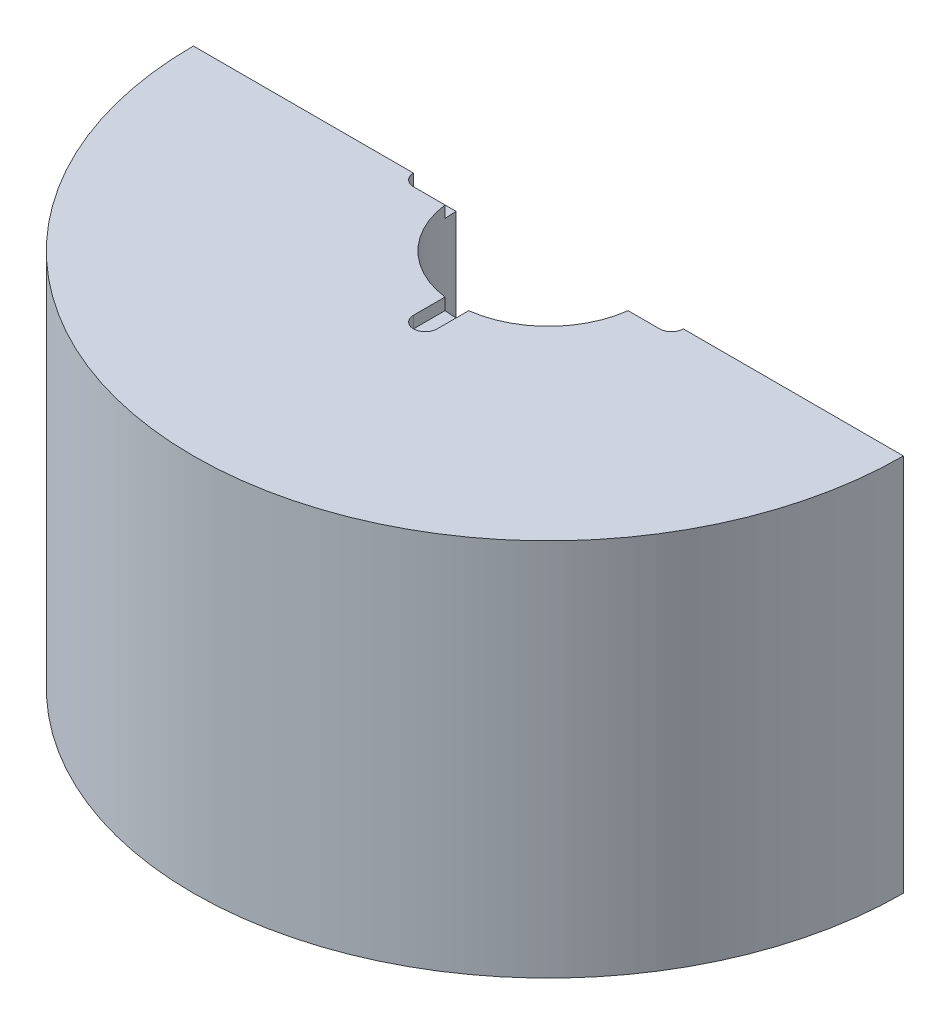
ISO-10303-21;
HEADER;
FILE_DESCRIPTION(('STEP AP214'),'2;1');
FILE_NAME('part.step','',(''),(''),'','','');
FILE_SCHEMA(('AUTOMOTIVE_DESIGN { 1 0 10303 214 1 1 1 1 }'));
ENDSEC;
DATA;
#1=APPLICATION_CONTEXT('core data for automotive mechanical design processes');
#2=APPLICATION_PROTOCOL_DEFINITION('international standard','automotive_design',2000,#1);
#3=PRODUCT_CONTEXT('',#1,'mechanical');
#4=PRODUCT('Part','Part','',(#3));
#5=PRODUCT_RELATED_PRODUCT_CATEGORY('part','',(#4));
#6=PRODUCT_DEFINITION_FORMATION('','',#4);
#7=PRODUCT_DEFINITION_CONTEXT('part definition',#1,'design');
#8=PRODUCT_DEFINITION('design','',#6,#7);
#9=PRODUCT_DEFINITION_SHAPE('','',#8);
#10=(LENGTH_UNIT() NAMED_UNIT(*) SI_UNIT(.MILLI.,.METRE.));
#11=(NAMED_UNIT(*) PLANE_ANGLE_UNIT() SI_UNIT($,.RADIAN.));
#12=(NAMED_UNIT(*) SI_UNIT($,.STERADIAN.) SOLID_ANGLE_UNIT());
#13=UNCERTAINTY_MEASURE_WITH_UNIT(LENGTH_MEASURE(1.E-05),#10,'distance_accuracy_value','');
#14=(GEOMETRIC_REPRESENTATION_CONTEXT(3) GLOBAL_UNCERTAINTY_ASSIGNED_CONTEXT((#13)) GLOBAL_UNIT_ASSIGNED_CONTEXT((#10,
#11,#12)) REPRESENTATION_CONTEXT('',''));
#15=CARTESIAN_POINT('',(0.,0.,0.));
#16=DIRECTION('',(0.,0.,1.));
#17=DIRECTION('',(1.,0.,0.));
#18=AXIS2_PLACEMENT_3D('',#15,#16,#17);
#19=CARTESIAN_POINT('',(0.,0.,0.));
#20=DIRECTION('',(0.,1.,0.));
#21=DIRECTION('',(0.,0.,1.));
#22=AXIS2_PLACEMENT_3D('',#19,#20,#21);
#23=PLANE('',#22);
#24=CARTESIAN_POINT('',(0.,0.,0.));
#25=DIRECTION('',(0.,1.,0.));
#26=DIRECTION('',(0.,0.,1.));
#27=AXIS2_PLACEMENT_3D('',#24,#25,#26);
#28=CIRCLE('',#27,39.);
#29=CARTESIAN_POINT('',(-38.6781592116275,0.,4.99999999999987));
#30=VERTEX_POINT('',#29);
#31=CARTESIAN_POINT('',(-4.99999999999999,0.,38.6781592116274));
#32=VERTEX_POINT('',#31);
#33=EDGE_CURVE('E469',#30,#32,#28,.T.);
#34=ORIENTED_EDGE('',*,*,#33,.T.);
#35=DIRECTION('',(0.,0.,-1.));
#36=VECTOR('',#35,1.);
#37=CARTESIAN_POINT('',(-4.99999999999999,0.,52.));
#38=LINE('',#37,#36);
#39=CARTESIAN_POINT('',(-4.99999999999999,0.,52.));
#40=VERTEX_POINT('',#39);
#41=EDGE_CURVE('E294',#40,#32,#38,.T.);
#42=ORIENTED_EDGE('',*,*,#41,.F.);
#43=CARTESIAN_POINT('',(0.,0.,52.));
#44=DIRECTION('',(0.,1.,0.));
#45=DIRECTION('',(0.,0.,1.));
#46=AXIS2_PLACEMENT_3D('',#43,#44,#45);
#47=CIRCLE('',#46,5.);
#48=CARTESIAN_POINT('',(5.00000000000001,0.,52.));
#49=VERTEX_POINT('',#48);
#50=EDGE_CURVE('E288',#40,#49,#47,.T.);
#51=ORIENTED_EDGE('',*,*,#50,.T.);
#52=DIRECTION('',(0.,0.,-1.));
#53=VECTOR('',#52,1.);
#54=CARTESIAN_POINT('',(5.00000000000001,0.,52.));
#55=LINE('',#54,#53);
#56=CARTESIAN_POINT('',(5.00000000000001,0.,38.6781592116274));
#57=VERTEX_POINT('',#56);
#58=EDGE_CURVE('E123',#49,#57,#55,.T.);
#59=ORIENTED_EDGE('',*,*,#58,.T.);
#60=CARTESIAN_POINT('',(38.6781592116274,0.,5.00000000000041));
#61=VERTEX_POINT('',#60);
#62=EDGE_CURVE('E450',#57,#61,#28,.T.);
#63=ORIENTED_EDGE('',*,*,#62,.T.);
#64=DIRECTION('',(-1.,0.,0.));
#65=VECTOR('',#64,1.);
#66=CARTESIAN_POINT('',(51.9999999999999,0.,5.00000000000055));
#67=LINE('',#66,#65);
#68=CARTESIAN_POINT('',(51.9999999999999,0.,5.00000000000055));
#69=VERTEX_POINT('',#68);
#70=EDGE_CURVE('E313',#69,#61,#67,.T.);
#71=ORIENTED_EDGE('',*,*,#70,.F.);
#72=CARTESIAN_POINT('',(52.,0.,5.4524181940787E-13));
#73=DIRECTION('',(0.,1.,0.));
#74=DIRECTION('',(0.,0.,1.));
#75=AXIS2_PLACEMENT_3D('',#72,#73,#74);
#76=CIRCLE('',#75,5.);
#77=CARTESIAN_POINT('',(57.,0.,0.));
#78=VERTEX_POINT('',#77);
#79=EDGE_CURVE('E307',#69,#78,#76,.T.);
#80=ORIENTED_EDGE('',*,*,#79,.T.);
#81=DIRECTION('',(1.,0.,0.));
#82=VECTOR('',#81,1.);
#83=CARTESIAN_POINT('',(0.,0.,0.));
#84=LINE('',#83,#82);
#85=CARTESIAN_POINT('',(150.,0.,0.));
#86=VERTEX_POINT('',#85);
#87=EDGE_CURVE('E456',#78,#86,#84,.T.);
#88=ORIENTED_EDGE('',*,*,#87,.T.);
#89=CARTESIAN_POINT('',(0.,0.,0.));
#90=DIRECTION('',(0.,1.,0.));
#91=DIRECTION('',(0.,0.,1.));
#92=AXIS2_PLACEMENT_3D('',#89,#90,#91);
#93=CIRCLE('',#92,150.);
#94=CARTESIAN_POINT('',(-150.,0.,0.));
#95=VERTEX_POINT('',#94);
#96=EDGE_CURVE('E474',#95,#86,#93,.T.);
#97=ORIENTED_EDGE('',*,*,#96,.F.);
#98=CARTESIAN_POINT('',(-57.,0.,0.));
#99=VERTEX_POINT('',#98);
#100=EDGE_CURVE('E470',#95,#99,#84,.T.);
#101=ORIENTED_EDGE('',*,*,#100,.T.);
#102=CARTESIAN_POINT('',(-52.,0.,-1.7865831321623E-13));
#103=DIRECTION('',(0.,1.,0.));
#104=DIRECTION('',(0.,0.,1.));
#105=AXIS2_PLACEMENT_3D('',#102,#103,#104);
#106=CIRCLE('',#105,5.);
#107=CARTESIAN_POINT('',(-52.,0.,4.99999999999982));
#108=VERTEX_POINT('',#107);
#109=EDGE_CURVE('E508',#108,#99,#106,.F.);
#110=ORIENTED_EDGE('',*,*,#109,.F.);
#111=DIRECTION('',(1.,0.,0.));
#112=VECTOR('',#111,1.);
#113=CARTESIAN_POINT('',(-52.,0.,4.99999999999982));
#114=LINE('',#113,#112);
#115=EDGE_CURVE('E318',#108,#30,#114,.T.);
#116=ORIENTED_EDGE('',*,*,#115,.T.);
#117=EDGE_LOOP('',(#34,#42,#51,#59,#63,#71,#80,#88,#97,#101,#110,#116));
#118=FACE_BOUND('',#117,.T.);
#119=ADVANCED_FACE('F107',(#118),#23,.F.);
#120=CARTESIAN_POINT('',(0.,160.,0.));
#121=DIRECTION('',(0.,-1.,0.));
#122=DIRECTION('',(0.,0.,-1.));
#123=AXIS2_PLACEMENT_3D('',#120,#121,#122);
#124=CYLINDRICAL_SURFACE('',#123,39.);
#125=DIRECTION('',(0.,-1.,0.));
#126=VECTOR('',#125,1.);
#127=CARTESIAN_POINT('',(-4.99999999999999,160.,38.6781592116274));
#128=LINE('',#127,#126);
#129=CARTESIAN_POINT('',(-4.99999999999999,5.,38.6781592116274));
#130=VERTEX_POINT('',#129);
#131=EDGE_CURVE('E352',#32,#130,#128,.F.);
#132=ORIENTED_EDGE('',*,*,#131,.F.);
#133=ORIENTED_EDGE('',*,*,#33,.F.);
#134=DIRECTION('',(0.,-1.,0.));
#135=VECTOR('',#134,1.);
#136=CARTESIAN_POINT('',(-38.6781592116275,160.,4.99999999999987));
#137=LINE('',#136,#135);
#138=CARTESIAN_POINT('',(-38.6781592116275,5.,4.99999999999987));
#139=VERTEX_POINT('',#138);
#140=EDGE_CURVE('E278',#30,#139,#137,.F.);
#141=ORIENTED_EDGE('',*,*,#140,.T.);
#142=CARTESIAN_POINT('',(0.,5.,0.));
#143=DIRECTION('',(0.,1.,0.));
#144=DIRECTION('',(0.,0.,1.));
#145=AXIS2_PLACEMENT_3D('',#142,#143,#144);
#146=CIRCLE('',#145,39.);
#147=CARTESIAN_POINT('',(-39.,5.,0.));
#148=VERTEX_POINT('',#147);
#149=EDGE_CURVE('E358',#148,#139,#146,.T.);
#150=ORIENTED_EDGE('',*,*,#149,.F.);
#151=DIRECTION('',(0.,-1.,0.));
#152=VECTOR('',#151,1.);
#153=CARTESIAN_POINT('',(-39.,160.,0.));
#154=LINE('',#153,#152);
#155=CARTESIAN_POINT('',(-39.,155.,0.));
#156=VERTEX_POINT('',#155);
#157=EDGE_CURVE('E489',#156,#148,#154,.T.);
#158=ORIENTED_EDGE('',*,*,#157,.F.);
#159=CARTESIAN_POINT('',(0.,155.,0.));
#160=DIRECTION('',(0.,1.,0.));
#161=DIRECTION('',(0.,0.,1.));
#162=AXIS2_PLACEMENT_3D('',#159,#160,#161);
#163=CIRCLE('',#162,39.);
#164=CARTESIAN_POINT('',(-38.6781592116275,155.,4.99999999999987));
#165=VERTEX_POINT('',#164);
#166=EDGE_CURVE('E370',#165,#156,#163,.F.);
#167=ORIENTED_EDGE('',*,*,#166,.F.);
#168=DIRECTION('',(0.,1.,0.));
#169=VECTOR('',#168,1.);
#170=CARTESIAN_POINT('',(-38.6781592116275,155.,4.99999999999987));
#171=LINE('',#170,#169);
#172=CARTESIAN_POINT('',(-38.6781592116275,160.,4.99999999999987));
#173=VERTEX_POINT('',#172);
#174=EDGE_CURVE('E377',#165,#173,#171,.T.);
#175=ORIENTED_EDGE('',*,*,#174,.T.);
#176=CARTESIAN_POINT('',(0.,160.,0.));
#177=DIRECTION('',(0.,1.,0.));
#178=DIRECTION('',(0.,0.,1.));
#179=AXIS2_PLACEMENT_3D('',#176,#177,#178);
#180=CIRCLE('',#179,39.);
#181=CARTESIAN_POINT('',(-4.99999999999999,160.,38.6781592116274));
#182=VERTEX_POINT('',#181);
#183=EDGE_CURVE('E455',#173,#182,#180,.T.);
#184=ORIENTED_EDGE('',*,*,#183,.T.);
#185=DIRECTION('',(0.,-1.,0.));
#186=VECTOR('',#185,1.);
#187=CARTESIAN_POINT('',(-4.99999999999999,160.,38.6781592116274));
#188=LINE('',#187,#186);
#189=CARTESIAN_POINT('',(-4.99999999999999,155.,38.6781592116274));
#190=VERTEX_POINT('',#189);
#191=EDGE_CURVE('E381',#182,#190,#188,.T.);
#192=ORIENTED_EDGE('',*,*,#191,.T.);
#193=CARTESIAN_POINT('',(0.,155.,0.));
#194=DIRECTION('',(0.,1.,0.));
#195=DIRECTION('',(0.,0.,1.));
#196=AXIS2_PLACEMENT_3D('',#193,#194,#195);
#197=CIRCLE('',#196,39.);
#198=CARTESIAN_POINT('',(5.00000000000001,155.,38.6781592116274));
#199=VERTEX_POINT('',#198);
#200=EDGE_CURVE('E504',#190,#199,#197,.T.);
#201=ORIENTED_EDGE('',*,*,#200,.T.);
#202=DIRECTION('',(0.,-1.,0.));
#203=VECTOR('',#202,1.);
#204=CARTESIAN_POINT('',(5.00000000000001,160.,38.6781592116274));
#205=LINE('',#204,#203);
#206=CARTESIAN_POINT('',(5.00000000000001,160.,38.6781592116274));
#207=VERTEX_POINT('',#206);
#208=EDGE_CURVE('E441',#207,#199,#205,.T.);
#209=ORIENTED_EDGE('',*,*,#208,.F.);
#210=CARTESIAN_POINT('',(38.6781592116274,160.,5.00000000000041));
#211=VERTEX_POINT('',#210);
#212=EDGE_CURVE('E451',#207,#211,#180,.T.);
#213=ORIENTED_EDGE('',*,*,#212,.T.);
#214=DIRECTION('',(0.,1.,0.));
#215=VECTOR('',#214,1.);
#216=CARTESIAN_POINT('',(38.6781592116274,155.,5.00000000000041));
#217=LINE('',#216,#215);
#218=CARTESIAN_POINT('',(38.6781592116274,155.,5.00000000000041));
#219=VERTEX_POINT('',#218);
#220=EDGE_CURVE('E390',#219,#211,#217,.T.);
#221=ORIENTED_EDGE('',*,*,#220,.F.);
#222=CARTESIAN_POINT('',(0.,155.,0.));
#223=DIRECTION('',(0.,1.,0.));
#224=DIRECTION('',(0.,0.,1.));
#225=AXIS2_PLACEMENT_3D('',#222,#223,#224);
#226=CIRCLE('',#225,39.);
#227=CARTESIAN_POINT('',(39.,155.,0.));
#228=VERTEX_POINT('',#227);
#229=EDGE_CURVE('E389',#219,#228,#226,.T.);
#230=ORIENTED_EDGE('',*,*,#229,.T.);
#231=DIRECTION('',(0.,-1.,0.));
#232=VECTOR('',#231,1.);
#233=CARTESIAN_POINT('',(39.,160.,0.));
#234=LINE('',#233,#232);
#235=CARTESIAN_POINT('',(39.,5.,0.));
#236=VERTEX_POINT('',#235);
#237=EDGE_CURVE('E478',#228,#236,#234,.T.);
#238=ORIENTED_EDGE('',*,*,#237,.T.);
#239=CARTESIAN_POINT('',(0.,5.,0.));
#240=DIRECTION('',(0.,1.,0.));
#241=DIRECTION('',(0.,0.,1.));
#242=AXIS2_PLACEMENT_3D('',#239,#240,#241);
#243=CIRCLE('',#242,39.);
#244=CARTESIAN_POINT('',(38.6781592116274,5.,5.00000000000041));
#245=VERTEX_POINT('',#244);
#246=EDGE_CURVE('E355',#245,#236,#243,.T.);
#247=ORIENTED_EDGE('',*,*,#246,.F.);
#248=DIRECTION('',(0.,-1.,0.));
#249=VECTOR('',#248,1.);
#250=CARTESIAN_POINT('',(38.6781592116274,160.,5.00000000000041));
#251=LINE('',#250,#249);
#252=EDGE_CURVE('E346',#61,#245,#251,.F.);
#253=ORIENTED_EDGE('',*,*,#252,.F.);
#254=ORIENTED_EDGE('',*,*,#62,.F.);
#255=DIRECTION('',(0.,-1.,0.));
#256=VECTOR('',#255,1.);
#257=CARTESIAN_POINT('',(5.00000000000001,160.,38.6781592116274));
#258=LINE('',#257,#256);
#259=CARTESIAN_POINT('',(5.00000000000001,5.,38.6781592116274));
#260=VERTEX_POINT('',#259);
#261=EDGE_CURVE('E349',#57,#260,#258,.F.);
#262=ORIENTED_EDGE('',*,*,#261,.T.);
#263=CARTESIAN_POINT('',(0.,5.,0.));
#264=DIRECTION('',(0.,1.,0.));
#265=DIRECTION('',(0.,0.,1.));
#266=AXIS2_PLACEMENT_3D('',#263,#264,#265);
#267=CIRCLE('',#266,39.);
#268=EDGE_CURVE('E12',#130,#260,#267,.T.);
#269=ORIENTED_EDGE('',*,*,#268,.F.);
#270=EDGE_LOOP('',(#132,#133,#141,#150,#158,#167,#175,#184,#192,#201,#209,#213,#221,#230,#238,
#247,#253,#254,#262,#269));
#271=FACE_BOUND('',#270,.T.);
#272=ADVANCED_FACE('F109',(#271),#124,.F.);
#273=CARTESIAN_POINT('',(0.,160.,0.));
#274=DIRECTION('',(0.,1.,0.));
#275=DIRECTION('',(0.,0.,1.));
#276=AXIS2_PLACEMENT_3D('',#273,#274,#275);
#277=PLANE('',#276);
#278=DIRECTION('',(1.,0.,0.));
#279=VECTOR('',#278,1.);
#280=CARTESIAN_POINT('',(0.,160.,5.));
#281=LINE('',#280,#279);
#282=CARTESIAN_POINT('',(-52.,160.,4.99999999999982));
#283=VERTEX_POINT('',#282);
#284=EDGE_CURVE('E366',#283,#173,#281,.T.);
#285=ORIENTED_EDGE('',*,*,#284,.F.);
#286=CARTESIAN_POINT('',(-52.,160.,-1.7865831321623E-13));
#287=DIRECTION('',(0.,1.,0.));
#288=DIRECTION('',(0.,0.,1.));
#289=AXIS2_PLACEMENT_3D('',#286,#287,#288);
#290=CIRCLE('',#289,5.);
#291=CARTESIAN_POINT('',(-57.,160.,0.));
#292=VERTEX_POINT('',#291);
#293=EDGE_CURVE('E493',#292,#283,#290,.T.);
#294=ORIENTED_EDGE('',*,*,#293,.F.);
#295=DIRECTION('',(1.,0.,0.));
#296=VECTOR('',#295,1.);
#297=CARTESIAN_POINT('',(0.,160.,0.));
#298=LINE('',#297,#296);
#299=CARTESIAN_POINT('',(-150.,160.,0.));
#300=VERTEX_POINT('',#299);
#301=EDGE_CURVE('E457',#300,#292,#298,.T.);
#302=ORIENTED_EDGE('',*,*,#301,.F.);
#303=CARTESIAN_POINT('',(0.,160.,0.));
#304=DIRECTION('',(0.,1.,0.));
#305=DIRECTION('',(0.,0.,1.));
#306=AXIS2_PLACEMENT_3D('',#303,#304,#305);
#307=CIRCLE('',#306,150.);
#308=CARTESIAN_POINT('',(150.,160.,0.));
#309=VERTEX_POINT('',#308);
#310=EDGE_CURVE('E461',#300,#309,#307,.T.);
#311=ORIENTED_EDGE('',*,*,#310,.T.);
#312=CARTESIAN_POINT('',(57.,160.,0.));
#313=VERTEX_POINT('',#312);
#314=EDGE_CURVE('E462',#313,#309,#298,.T.);
#315=ORIENTED_EDGE('',*,*,#314,.F.);
#316=CARTESIAN_POINT('',(52.,160.,5.4524181940787E-13));
#317=DIRECTION('',(0.,1.,0.));
#318=DIRECTION('',(0.,0.,1.));
#319=AXIS2_PLACEMENT_3D('',#316,#317,#318);
#320=CIRCLE('',#319,5.);
#321=CARTESIAN_POINT('',(52.,160.,5.00000000000055));
#322=VERTEX_POINT('',#321);
#323=EDGE_CURVE('E394',#322,#313,#320,.T.);
#324=ORIENTED_EDGE('',*,*,#323,.F.);
#325=DIRECTION('',(-1.,0.,0.));
#326=VECTOR('',#325,1.);
#327=CARTESIAN_POINT('',(0.,160.,5.));
#328=LINE('',#327,#326);
#329=EDGE_CURVE('E376',#322,#211,#328,.T.);
#330=ORIENTED_EDGE('',*,*,#329,.T.);
#331=ORIENTED_EDGE('',*,*,#212,.F.);
#332=DIRECTION('',(0.,0.,-1.));
#333=VECTOR('',#332,1.);
#334=CARTESIAN_POINT('',(5.00000000000001,160.,52.));
#335=LINE('',#334,#333);
#336=CARTESIAN_POINT('',(5.00000000000001,160.,52.));
#337=VERTEX_POINT('',#336);
#338=EDGE_CURVE('E393',#337,#207,#335,.T.);
#339=ORIENTED_EDGE('',*,*,#338,.F.);
#340=CARTESIAN_POINT('',(0.,160.,52.));
#341=DIRECTION('',(0.,1.,0.));
#342=DIRECTION('',(0.,0.,1.));
#343=AXIS2_PLACEMENT_3D('',#340,#341,#342);
#344=CIRCLE('',#343,5.);
#345=CARTESIAN_POINT('',(-4.99999999999999,160.,52.));
#346=VERTEX_POINT('',#345);
#347=EDGE_CURVE('E422',#346,#337,#344,.T.);
#348=ORIENTED_EDGE('',*,*,#347,.F.);
#349=DIRECTION('',(0.,0.,-1.));
#350=VECTOR('',#349,1.);
#351=CARTESIAN_POINT('',(-4.99999999999999,160.,52.));
#352=LINE('',#351,#350);
#353=EDGE_CURVE('E411',#346,#182,#352,.T.);
#354=ORIENTED_EDGE('',*,*,#353,.T.);
#355=ORIENTED_EDGE('',*,*,#183,.F.);
#356=EDGE_LOOP('',(#285,#294,#302,#311,#315,#324,#330,#331,#339,#348,#354,#355));
#357=FACE_BOUND('',#356,.T.);
#358=ADVANCED_FACE('F542',(#357),#277,.T.);
#359=CARTESIAN_POINT('',(0.,160.,0.));
#360=DIRECTION('',(0.,0.,-1.));
#361=DIRECTION('',(-1.,0.,0.));
#362=AXIS2_PLACEMENT_3D('',#359,#360,#361);
#363=PLANE('',#362);
#364=DIRECTION('',(1.,0.,0.));
#365=VECTOR('',#364,1.);
#366=CARTESIAN_POINT('',(0.,5.,0.));
#367=LINE('',#366,#365);
#368=CARTESIAN_POINT('',(-57.,5.,0.));
#369=VERTEX_POINT('',#368);
#370=EDGE_CURVE('E116',#369,#148,#367,.T.);
#371=ORIENTED_EDGE('',*,*,#370,.F.);
#372=DIRECTION('',(0.,-1.,0.));
#373=VECTOR('',#372,1.);
#374=CARTESIAN_POINT('',(-57.,5.,0.));
#375=LINE('',#374,#373);
#376=EDGE_CURVE('E340',#369,#99,#375,.T.);
#377=ORIENTED_EDGE('',*,*,#376,.T.);
#378=ORIENTED_EDGE('',*,*,#100,.F.);
#379=DIRECTION('',(0.,-1.,0.));
#380=VECTOR('',#379,1.);
#381=CARTESIAN_POINT('',(-150.,160.,0.));
#382=LINE('',#381,#380);
#383=EDGE_CURVE('E486',#300,#95,#382,.T.);
#384=ORIENTED_EDGE('',*,*,#383,.F.);
#385=ORIENTED_EDGE('',*,*,#301,.T.);
#386=DIRECTION('',(0.,1.,0.));
#387=VECTOR('',#386,1.);
#388=CARTESIAN_POINT('',(-57.,155.,0.));
#389=LINE('',#388,#387);
#390=CARTESIAN_POINT('',(-57.,155.,0.));
#391=VERTEX_POINT('',#390);
#392=EDGE_CURVE('E447',#391,#292,#389,.T.);
#393=ORIENTED_EDGE('',*,*,#392,.F.);
#394=DIRECTION('',(1.,0.,0.));
#395=VECTOR('',#394,1.);
#396=CARTESIAN_POINT('',(0.,155.,0.));
#397=LINE('',#396,#395);
#398=EDGE_CURVE('E500',#391,#156,#397,.T.);
#399=ORIENTED_EDGE('',*,*,#398,.T.);
#400=ORIENTED_EDGE('',*,*,#157,.T.);
#401=EDGE_LOOP('',(#371,#377,#378,#384,#385,#393,#399,#400));
#402=FACE_BOUND('',#401,.T.);
#403=ADVANCED_FACE('F526',(#402),#363,.T.);
#404=CARTESIAN_POINT('',(0.,160.,0.));
#405=DIRECTION('',(0.,-1.,0.));
#406=DIRECTION('',(0.,0.,-1.));
#407=AXIS2_PLACEMENT_3D('',#404,#405,#406);
#408=CYLINDRICAL_SURFACE('',#407,150.);
#409=ORIENTED_EDGE('',*,*,#96,.T.);
#410=DIRECTION('',(0.,-1.,0.));
#411=VECTOR('',#410,1.);
#412=CARTESIAN_POINT('',(150.,160.,0.));
#413=LINE('',#412,#411);
#414=EDGE_CURVE('E482',#309,#86,#413,.T.);
#415=ORIENTED_EDGE('',*,*,#414,.F.);
#416=ORIENTED_EDGE('',*,*,#310,.F.);
#417=ORIENTED_EDGE('',*,*,#383,.T.);
#418=EDGE_LOOP('',(#409,#415,#416,#417));
#419=FACE_BOUND('',#418,.T.);
#420=ADVANCED_FACE('F602',(#419),#408,.T.);
#421=DIRECTION('',(1.,0.,0.));
#422=VECTOR('',#421,1.);
#423=CARTESIAN_POINT('',(0.,5.,0.));
#424=LINE('',#423,#422);
#425=CARTESIAN_POINT('',(57.,5.,0.));
#426=VERTEX_POINT('',#425);
#427=EDGE_CURVE('E511',#236,#426,#424,.T.);
#428=ORIENTED_EDGE('',*,*,#427,.F.);
#429=ORIENTED_EDGE('',*,*,#237,.F.);
#430=DIRECTION('',(1.,0.,0.));
#431=VECTOR('',#430,1.);
#432=CARTESIAN_POINT('',(0.,155.,0.));
#433=LINE('',#432,#431);
#434=CARTESIAN_POINT('',(57.,155.,0.));
#435=VERTEX_POINT('',#434);
#436=EDGE_CURVE('E496',#228,#435,#433,.T.);
#437=ORIENTED_EDGE('',*,*,#436,.T.);
#438=DIRECTION('',(0.,1.,0.));
#439=VECTOR('',#438,1.);
#440=CARTESIAN_POINT('',(57.,155.,0.));
#441=LINE('',#440,#439);
#442=EDGE_CURVE('E444',#313,#435,#441,.F.);
#443=ORIENTED_EDGE('',*,*,#442,.F.);
#444=ORIENTED_EDGE('',*,*,#314,.T.);
#445=ORIENTED_EDGE('',*,*,#414,.T.);
#446=ORIENTED_EDGE('',*,*,#87,.F.);
#447=DIRECTION('',(0.,-1.,0.));
#448=VECTOR('',#447,1.);
#449=CARTESIAN_POINT('',(57.,5.,0.));
#450=LINE('',#449,#448);
#451=EDGE_CURVE('E131',#78,#426,#450,.F.);
#452=ORIENTED_EDGE('',*,*,#451,.T.);
#453=EDGE_LOOP('',(#428,#429,#437,#443,#444,#445,#446,#452));
#454=FACE_BOUND('',#453,.T.);
#455=ADVANCED_FACE('F569',(#454),#363,.T.);
#456=CARTESIAN_POINT('',(0.,155.,52.));
#457=DIRECTION('',(0.,1.,0.));
#458=DIRECTION('',(0.,0.,1.));
#459=AXIS2_PLACEMENT_3D('',#456,#457,#458);
#460=PLANE('',#459);
#461=DIRECTION('',(0.,0.,-1.));
#462=VECTOR('',#461,1.);
#463=CARTESIAN_POINT('',(-4.99999999999999,155.,52.));
#464=LINE('',#463,#462);
#465=CARTESIAN_POINT('',(-4.99999999999999,155.,52.));
#466=VERTEX_POINT('',#465);
#467=EDGE_CURVE('E418',#466,#190,#464,.T.);
#468=ORIENTED_EDGE('',*,*,#467,.F.);
#469=CARTESIAN_POINT('',(0.,155.,52.));
#470=DIRECTION('',(0.,1.,0.));
#471=DIRECTION('',(0.,0.,1.));
#472=AXIS2_PLACEMENT_3D('',#469,#470,#471);
#473=CIRCLE('',#472,5.);
#474=CARTESIAN_POINT('',(5.00000000000001,155.,52.));
#475=VERTEX_POINT('',#474);
#476=EDGE_CURVE('E431',#466,#475,#473,.T.);
#477=ORIENTED_EDGE('',*,*,#476,.T.);
#478=DIRECTION('',(0.,0.,-1.));
#479=VECTOR('',#478,1.);
#480=CARTESIAN_POINT('',(5.00000000000001,155.,52.));
#481=LINE('',#480,#479);
#482=EDGE_CURVE('E415',#475,#199,#481,.T.);
#483=ORIENTED_EDGE('',*,*,#482,.T.);
#484=ORIENTED_EDGE('',*,*,#200,.F.);
#485=EDGE_LOOP('',(#468,#477,#483,#484));
#486=FACE_BOUND('',#485,.T.);
#487=ADVANCED_FACE('F601',(#486),#460,.T.);
#488=CARTESIAN_POINT('',(0.,155.,52.));
#489=DIRECTION('',(0.,1.,0.));
#490=DIRECTION('',(0.,0.,1.));
#491=AXIS2_PLACEMENT_3D('',#488,#489,#490);
#492=CYLINDRICAL_SURFACE('',#491,5.);
#493=ORIENTED_EDGE('',*,*,#347,.T.);
#494=DIRECTION('',(0.,1.,0.));
#495=VECTOR('',#494,1.);
#496=CARTESIAN_POINT('',(5.00000000000001,155.,52.));
#497=LINE('',#496,#495);
#498=EDGE_CURVE('E428',#337,#475,#497,.F.);
#499=ORIENTED_EDGE('',*,*,#498,.T.);
#500=ORIENTED_EDGE('',*,*,#476,.F.);
#501=DIRECTION('',(0.,1.,0.));
#502=VECTOR('',#501,1.);
#503=CARTESIAN_POINT('',(-4.99999999999999,155.,52.));
#504=LINE('',#503,#502);
#505=EDGE_CURVE('E361',#346,#466,#504,.F.);
#506=ORIENTED_EDGE('',*,*,#505,.F.);
#507=EDGE_LOOP('',(#493,#499,#500,#506));
#508=FACE_BOUND('',#507,.T.);
#509=ADVANCED_FACE('F603',(#508),#492,.F.);
#510=CARTESIAN_POINT('',(5.00000000000001,155.,52.));
#511=DIRECTION('',(1.,0.,0.));
#512=DIRECTION('',(0.,0.,-1.));
#513=AXIS2_PLACEMENT_3D('',#510,#511,#512);
#514=PLANE('',#513);
#515=ORIENTED_EDGE('',*,*,#208,.T.);
#516=ORIENTED_EDGE('',*,*,#482,.F.);
#517=ORIENTED_EDGE('',*,*,#498,.F.);
#518=ORIENTED_EDGE('',*,*,#338,.T.);
#519=EDGE_LOOP('',(#515,#516,#517,#518));
#520=FACE_BOUND('',#519,.T.);
#521=ADVANCED_FACE('F630',(#520),#514,.F.);
#522=CARTESIAN_POINT('',(-4.99999999999999,155.,52.));
#523=DIRECTION('',(1.,0.,0.));
#524=DIRECTION('',(0.,0.,-1.));
#525=AXIS2_PLACEMENT_3D('',#522,#523,#524);
#526=PLANE('',#525);
#527=ORIENTED_EDGE('',*,*,#353,.F.);
#528=ORIENTED_EDGE('',*,*,#505,.T.);
#529=ORIENTED_EDGE('',*,*,#467,.T.);
#530=ORIENTED_EDGE('',*,*,#191,.F.);
#531=EDGE_LOOP('',(#527,#528,#529,#530));
#532=FACE_BOUND('',#531,.T.);
#533=ADVANCED_FACE('F622',(#532),#526,.T.);
#534=CARTESIAN_POINT('',(0.,155.,5.));
#535=DIRECTION('',(0.,0.,-1.));
#536=DIRECTION('',(-1.,0.,0.));
#537=AXIS2_PLACEMENT_3D('',#534,#535,#536);
#538=PLANE('',#537);
#539=ORIENTED_EDGE('',*,*,#329,.F.);
#540=DIRECTION('',(0.,1.,0.));
#541=VECTOR('',#540,1.);
#542=CARTESIAN_POINT('',(51.9999999999999,155.,5.00000000000055));
#543=LINE('',#542,#541);
#544=CARTESIAN_POINT('',(51.9999999999999,155.,5.00000000000055));
#545=VERTEX_POINT('',#544);
#546=EDGE_CURVE('E385',#545,#322,#543,.T.);
#547=ORIENTED_EDGE('',*,*,#546,.F.);
#548=DIRECTION('',(-1.,0.,0.));
#549=VECTOR('',#548,1.);
#550=CARTESIAN_POINT('',(0.,155.,5.));
#551=LINE('',#550,#549);
#552=EDGE_CURVE('E397',#545,#219,#551,.T.);
#553=ORIENTED_EDGE('',*,*,#552,.T.);
#554=ORIENTED_EDGE('',*,*,#220,.T.);
#555=EDGE_LOOP('',(#539,#547,#553,#554));
#556=FACE_BOUND('',#555,.T.);
#557=ADVANCED_FACE('F641',(#556),#538,.T.);
#558=CARTESIAN_POINT('',(52.,155.,5.4524181940787E-13));
#559=DIRECTION('',(0.,1.,0.));
#560=DIRECTION('',(0.,0.,1.));
#561=AXIS2_PLACEMENT_3D('',#558,#559,#560);
#562=CYLINDRICAL_SURFACE('',#561,5.);
#563=ORIENTED_EDGE('',*,*,#442,.T.);
#564=CARTESIAN_POINT('',(52.,155.,5.4524181940787E-13));
#565=DIRECTION('',(0.,1.,0.));
#566=DIRECTION('',(0.,0.,1.));
#567=AXIS2_PLACEMENT_3D('',#564,#565,#566);
#568=CIRCLE('',#567,5.);
#569=EDGE_CURVE('E404',#545,#435,#568,.T.);
#570=ORIENTED_EDGE('',*,*,#569,.F.);
#571=ORIENTED_EDGE('',*,*,#546,.T.);
#572=ORIENTED_EDGE('',*,*,#323,.T.);
#573=EDGE_LOOP('',(#563,#570,#571,#572));
#574=FACE_BOUND('',#573,.T.);
#575=ADVANCED_FACE('F656',(#574),#562,.F.);
#576=CARTESIAN_POINT('',(0.,155.,0.));
#577=DIRECTION('',(0.,1.,0.));
#578=DIRECTION('',(0.,0.,1.));
#579=AXIS2_PLACEMENT_3D('',#576,#577,#578);
#580=PLANE('',#579);
#581=ORIENTED_EDGE('',*,*,#229,.F.);
#582=ORIENTED_EDGE('',*,*,#552,.F.);
#583=ORIENTED_EDGE('',*,*,#569,.T.);
#584=ORIENTED_EDGE('',*,*,#436,.F.);
#585=EDGE_LOOP('',(#581,#582,#583,#584));
#586=FACE_BOUND('',#585,.T.);
#587=ADVANCED_FACE('F665',(#586),#580,.T.);
#588=CARTESIAN_POINT('',(0.,155.,5.));
#589=DIRECTION('',(0.,0.,1.));
#590=DIRECTION('',(1.,0.,0.));
#591=AXIS2_PLACEMENT_3D('',#588,#589,#590);
#592=PLANE('',#591);
#593=ORIENTED_EDGE('',*,*,#284,.T.);
#594=ORIENTED_EDGE('',*,*,#174,.F.);
#595=DIRECTION('',(1.,0.,0.));
#596=VECTOR('',#595,1.);
#597=CARTESIAN_POINT('',(0.,155.,5.));
#598=LINE('',#597,#596);
#599=CARTESIAN_POINT('',(-52.,155.,4.99999999999982));
#600=VERTEX_POINT('',#599);
#601=EDGE_CURVE('E365',#600,#165,#598,.T.);
#602=ORIENTED_EDGE('',*,*,#601,.F.);
#603=DIRECTION('',(0.,1.,0.));
#604=VECTOR('',#603,1.);
#605=CARTESIAN_POINT('',(-52.,155.,4.99999999999982));
#606=LINE('',#605,#604);
#607=EDGE_CURVE('E373',#600,#283,#606,.T.);
#608=ORIENTED_EDGE('',*,*,#607,.T.);
#609=EDGE_LOOP('',(#593,#594,#602,#608));
#610=FACE_BOUND('',#609,.T.);
#611=ADVANCED_FACE('F538',(#610),#592,.F.);
#612=CARTESIAN_POINT('',(-52.,155.,-1.7865831321623E-13));
#613=DIRECTION('',(0.,1.,0.));
#614=DIRECTION('',(0.,0.,1.));
#615=AXIS2_PLACEMENT_3D('',#612,#613,#614);
#616=CYLINDRICAL_SURFACE('',#615,5.);
#617=ORIENTED_EDGE('',*,*,#392,.T.);
#618=ORIENTED_EDGE('',*,*,#293,.T.);
#619=ORIENTED_EDGE('',*,*,#607,.F.);
#620=CARTESIAN_POINT('',(-52.,155.,-1.7865831321623E-13));
#621=DIRECTION('',(0.,1.,0.));
#622=DIRECTION('',(0.,0.,1.));
#623=AXIS2_PLACEMENT_3D('',#620,#621,#622);
#624=CIRCLE('',#623,5.);
#625=EDGE_CURVE('E362',#391,#600,#624,.T.);
#626=ORIENTED_EDGE('',*,*,#625,.F.);
#627=EDGE_LOOP('',(#617,#618,#619,#626));
#628=FACE_BOUND('',#627,.T.);
#629=ADVANCED_FACE('F533',(#628),#616,.F.);
#630=CARTESIAN_POINT('',(0.,155.,0.));
#631=DIRECTION('',(0.,1.,0.));
#632=DIRECTION('',(0.,0.,1.));
#633=AXIS2_PLACEMENT_3D('',#630,#631,#632);
#634=PLANE('',#633);
#635=ORIENTED_EDGE('',*,*,#625,.T.);
#636=ORIENTED_EDGE('',*,*,#601,.T.);
#637=ORIENTED_EDGE('',*,*,#166,.T.);
#638=ORIENTED_EDGE('',*,*,#398,.F.);
#639=EDGE_LOOP('',(#635,#636,#637,#638));
#640=FACE_BOUND('',#639,.T.);
#641=ADVANCED_FACE('F530',(#640),#634,.T.);
#642=CARTESIAN_POINT('',(-52.,5.,-1.7865831321623E-13));
#643=DIRECTION('',(0.,1.,0.));
#644=DIRECTION('',(0.,0.,1.));
#645=AXIS2_PLACEMENT_3D('',#642,#643,#644);
#646=PLANE('',#645);
#647=ORIENTED_EDGE('',*,*,#149,.T.);
#648=DIRECTION('',(1.,0.,0.));
#649=VECTOR('',#648,1.);
#650=CARTESIAN_POINT('',(-52.,5.,4.99999999999982));
#651=LINE('',#650,#649);
#652=CARTESIAN_POINT('',(-52.,5.,4.99999999999982));
#653=VERTEX_POINT('',#652);
#654=EDGE_CURVE('E327',#653,#139,#651,.T.);
#655=ORIENTED_EDGE('',*,*,#654,.F.);
#656=CARTESIAN_POINT('',(-52.,5.,-1.7865831321623E-13));
#657=DIRECTION('',(0.,1.,0.));
#658=DIRECTION('',(0.,0.,1.));
#659=AXIS2_PLACEMENT_3D('',#656,#657,#658);
#660=CIRCLE('',#659,5.);
#661=EDGE_CURVE('E331',#369,#653,#660,.T.);
#662=ORIENTED_EDGE('',*,*,#661,.F.);
#663=ORIENTED_EDGE('',*,*,#370,.T.);
#664=EDGE_LOOP('',(#647,#655,#662,#663));
#665=FACE_BOUND('',#664,.T.);
#666=ADVANCED_FACE('F518',(#665),#646,.F.);
#667=CARTESIAN_POINT('',(-52.,5.,-1.7865831321623E-13));
#668=DIRECTION('',(0.,-1.,0.));
#669=DIRECTION('',(0.,0.,-1.));
#670=AXIS2_PLACEMENT_3D('',#667,#668,#669);
#671=CYLINDRICAL_SURFACE('',#670,5.);
#672=ORIENTED_EDGE('',*,*,#661,.T.);
#673=DIRECTION('',(0.,-1.,0.));
#674=VECTOR('',#673,1.);
#675=CARTESIAN_POINT('',(-52.,5.,4.99999999999982));
#676=LINE('',#675,#674);
#677=EDGE_CURVE('E332',#653,#108,#676,.T.);
#678=ORIENTED_EDGE('',*,*,#677,.T.);
#679=ORIENTED_EDGE('',*,*,#109,.T.);
#680=ORIENTED_EDGE('',*,*,#376,.F.);
#681=EDGE_LOOP('',(#672,#678,#679,#680));
#682=FACE_BOUND('',#681,.T.);
#683=ADVANCED_FACE('F577',(#682),#671,.F.);
#684=CARTESIAN_POINT('',(-52.,5.,4.99999999999982));
#685=DIRECTION('',(0.,0.,-1.));
#686=DIRECTION('',(-1.,0.,0.));
#687=AXIS2_PLACEMENT_3D('',#684,#685,#686);
#688=PLANE('',#687);
#689=ORIENTED_EDGE('',*,*,#115,.F.);
#690=ORIENTED_EDGE('',*,*,#677,.F.);
#691=ORIENTED_EDGE('',*,*,#654,.T.);
#692=ORIENTED_EDGE('',*,*,#140,.F.);
#693=EDGE_LOOP('',(#689,#690,#691,#692));
#694=FACE_BOUND('',#693,.T.);
#695=ADVANCED_FACE('F580',(#694),#688,.T.);
#696=CARTESIAN_POINT('',(0.,5.,0.));
#697=DIRECTION('',(0.,1.,0.));
#698=DIRECTION('',(0.,0.,1.));
#699=AXIS2_PLACEMENT_3D('',#696,#697,#698);
#700=PLANE('',#699);
#701=ORIENTED_EDGE('',*,*,#246,.T.);
#702=ORIENTED_EDGE('',*,*,#427,.T.);
#703=CARTESIAN_POINT('',(52.,5.,5.4524181940787E-13));
#704=DIRECTION('',(0.,1.,0.));
#705=DIRECTION('',(0.,0.,1.));
#706=AXIS2_PLACEMENT_3D('',#703,#704,#705);
#707=CIRCLE('',#706,5.);
#708=CARTESIAN_POINT('',(51.9999999999999,5.,5.00000000000055));
#709=VERTEX_POINT('',#708);
#710=EDGE_CURVE('E310',#709,#426,#707,.T.);
#711=ORIENTED_EDGE('',*,*,#710,.F.);
#712=DIRECTION('',(-1.,0.,0.));
#713=VECTOR('',#712,1.);
#714=CARTESIAN_POINT('',(51.9999999999999,5.,5.00000000000055));
#715=LINE('',#714,#713);
#716=EDGE_CURVE('E317',#709,#245,#715,.T.);
#717=ORIENTED_EDGE('',*,*,#716,.T.);
#718=EDGE_LOOP('',(#701,#702,#711,#717));
#719=FACE_BOUND('',#718,.T.);
#720=ADVANCED_FACE('F564',(#719),#700,.F.);
#721=CARTESIAN_POINT('',(51.9999999999999,5.,5.00000000000055));
#722=DIRECTION('',(0.,0.,1.));
#723=DIRECTION('',(1.,0.,0.));
#724=AXIS2_PLACEMENT_3D('',#721,#722,#723);
#725=PLANE('',#724);
#726=ORIENTED_EDGE('',*,*,#252,.T.);
#727=ORIENTED_EDGE('',*,*,#716,.F.);
#728=DIRECTION('',(0.,-1.,0.));
#729=VECTOR('',#728,1.);
#730=CARTESIAN_POINT('',(51.9999999999999,5.,5.00000000000055));
#731=LINE('',#730,#729);
#732=EDGE_CURVE('E314',#709,#69,#731,.T.);
#733=ORIENTED_EDGE('',*,*,#732,.T.);
#734=ORIENTED_EDGE('',*,*,#70,.T.);
#735=EDGE_LOOP('',(#726,#727,#733,#734));
#736=FACE_BOUND('',#735,.T.);
#737=ADVANCED_FACE('F561',(#736),#725,.F.);
#738=CARTESIAN_POINT('',(52.,5.,5.4524181940787E-13));
#739=DIRECTION('',(0.,-1.,0.));
#740=DIRECTION('',(0.,0.,-1.));
#741=AXIS2_PLACEMENT_3D('',#738,#739,#740);
#742=CYLINDRICAL_SURFACE('',#741,5.);
#743=ORIENTED_EDGE('',*,*,#79,.F.);
#744=ORIENTED_EDGE('',*,*,#732,.F.);
#745=ORIENTED_EDGE('',*,*,#710,.T.);
#746=ORIENTED_EDGE('',*,*,#451,.F.);
#747=EDGE_LOOP('',(#743,#744,#745,#746));
#748=FACE_BOUND('',#747,.T.);
#749=ADVANCED_FACE('F566',(#748),#742,.F.);
#750=CARTESIAN_POINT('',(0.,5.,0.));
#751=DIRECTION('',(0.,1.,0.));
#752=DIRECTION('',(0.,0.,1.));
#753=AXIS2_PLACEMENT_3D('',#750,#751,#752);
#754=PLANE('',#753);
#755=ORIENTED_EDGE('',*,*,#268,.T.);
#756=DIRECTION('',(0.,0.,-1.));
#757=VECTOR('',#756,1.);
#758=CARTESIAN_POINT('',(5.00000000000001,5.,52.));
#759=LINE('',#758,#757);
#760=CARTESIAN_POINT('',(5.00000000000001,5.,52.));
#761=VERTEX_POINT('',#760);
#762=EDGE_CURVE('E272',#761,#260,#759,.T.);
#763=ORIENTED_EDGE('',*,*,#762,.F.);
#764=CARTESIAN_POINT('',(0.,5.,52.));
#765=DIRECTION('',(0.,1.,0.));
#766=DIRECTION('',(0.,0.,1.));
#767=AXIS2_PLACEMENT_3D('',#764,#765,#766);
#768=CIRCLE('',#767,5.);
#769=CARTESIAN_POINT('',(-4.99999999999999,5.,52.));
#770=VERTEX_POINT('',#769);
#771=EDGE_CURVE('E282',#770,#761,#768,.T.);
#772=ORIENTED_EDGE('',*,*,#771,.F.);
#773=DIRECTION('',(0.,0.,-1.));
#774=VECTOR('',#773,1.);
#775=CARTESIAN_POINT('',(-4.99999999999999,5.,52.));
#776=LINE('',#775,#774);
#777=EDGE_CURVE('E293',#770,#130,#776,.T.);
#778=ORIENTED_EDGE('',*,*,#777,.T.);
#779=EDGE_LOOP('',(#755,#763,#772,#778));
#780=FACE_BOUND('',#779,.T.);
#781=ADVANCED_FACE('F290',(#780),#754,.F.);
#782=CARTESIAN_POINT('',(-4.99999999999999,5.,52.));
#783=DIRECTION('',(-1.,0.,0.));
#784=DIRECTION('',(0.,0.,1.));
#785=AXIS2_PLACEMENT_3D('',#782,#783,#784);
#786=PLANE('',#785);
#787=ORIENTED_EDGE('',*,*,#131,.T.);
#788=ORIENTED_EDGE('',*,*,#777,.F.);
#789=DIRECTION('',(0.,-1.,0.));
#790=VECTOR('',#789,1.);
#791=CARTESIAN_POINT('',(-4.99999999999999,5.,52.));
#792=LINE('',#791,#790);
#793=EDGE_CURVE('E279',#770,#40,#792,.T.);
#794=ORIENTED_EDGE('',*,*,#793,.T.);
#795=ORIENTED_EDGE('',*,*,#41,.T.);
#796=EDGE_LOOP('',(#787,#788,#794,#795));
#797=FACE_BOUND('',#796,.T.);
#798=ADVANCED_FACE('F554',(#797),#786,.F.);
#799=CARTESIAN_POINT('',(5.00000000000001,5.,52.));
#800=DIRECTION('',(-1.,0.,0.));
#801=DIRECTION('',(0.,0.,1.));
#802=AXIS2_PLACEMENT_3D('',#799,#800,#801);
#803=PLANE('',#802);
#804=ORIENTED_EDGE('',*,*,#58,.F.);
#805=DIRECTION('',(0.,-1.,0.));
#806=VECTOR('',#805,1.);
#807=CARTESIAN_POINT('',(5.00000000000001,5.,52.));
#808=LINE('',#807,#806);
#809=EDGE_CURVE('E268',#761,#49,#808,.T.);
#810=ORIENTED_EDGE('',*,*,#809,.F.);
#811=ORIENTED_EDGE('',*,*,#762,.T.);
#812=ORIENTED_EDGE('',*,*,#261,.F.);
#813=EDGE_LOOP('',(#804,#810,#811,#812));
#814=FACE_BOUND('',#813,.T.);
#815=ADVANCED_FACE('F270',(#814),#803,.T.);
#816=CARTESIAN_POINT('',(0.,5.,52.));
#817=DIRECTION('',(0.,-1.,0.));
#818=DIRECTION('',(0.,0.,-1.));
#819=AXIS2_PLACEMENT_3D('',#816,#817,#818);
#820=CYLINDRICAL_SURFACE('',#819,5.);
#821=ORIENTED_EDGE('',*,*,#50,.F.);
#822=ORIENTED_EDGE('',*,*,#793,.F.);
#823=ORIENTED_EDGE('',*,*,#771,.T.);
#824=ORIENTED_EDGE('',*,*,#809,.T.);
#825=EDGE_LOOP('',(#821,#822,#823,#824));
#826=FACE_BOUND('',#825,.T.);
#827=ADVANCED_FACE('F283',(#826),#820,.F.);
#828=CLOSED_SHELL('',(#119,#272,#358,#403,#420,#455,#487,#509,#521,#533,#557,#575,#587,#611,
#629,#641,#666,#683,#695,#720,#737,#749,#781,#798,#815,#827));
#829=MANIFOLD_SOLID_BREP('B2',#828);
#830=ADVANCED_BREP_SHAPE_REPRESENTATION('',(#18,#829),#14);
#831=SHAPE_DEFINITION_REPRESENTATION(#9,#830);
ENDSEC;
END-ISO-10303-21;
